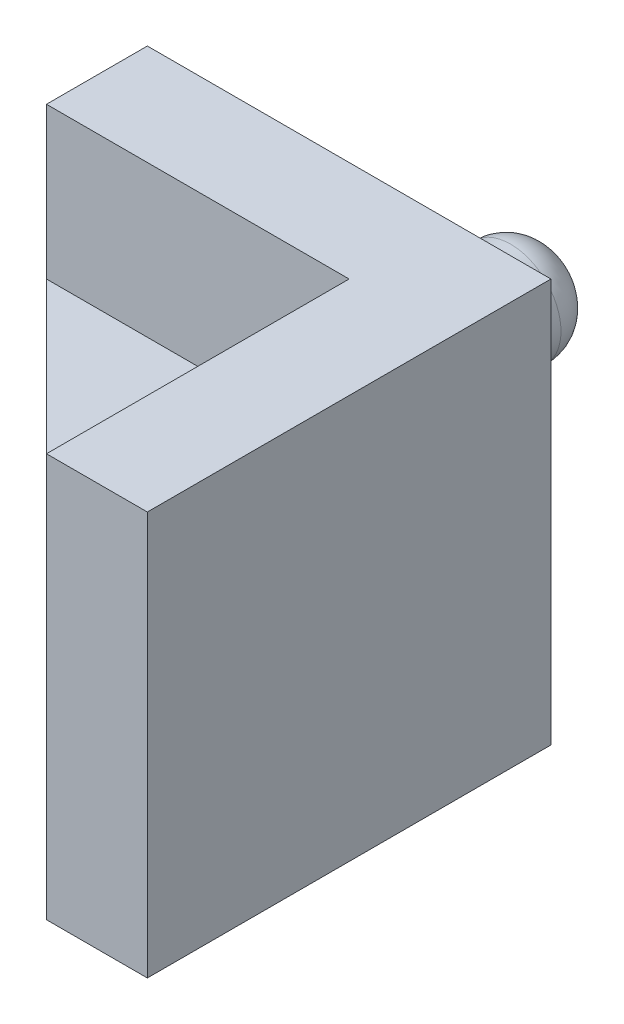
ISO-10303-21;
HEADER;
FILE_DESCRIPTION(('STEP AP214'),'2;1');
FILE_NAME('part.step','',(''),(''),'','','');
FILE_SCHEMA(('AUTOMOTIVE_DESIGN { 1 0 10303 214 1 1 1 1 }'));
ENDSEC;
DATA;
#1=APPLICATION_CONTEXT('core data for automotive mechanical design processes');
#2=APPLICATION_PROTOCOL_DEFINITION('international standard','automotive_design',2000,#1);
#3=PRODUCT_CONTEXT('',#1,'mechanical');
#4=PRODUCT('Part','Part','',(#3));
#5=PRODUCT_RELATED_PRODUCT_CATEGORY('part','',(#4));
#6=PRODUCT_DEFINITION_FORMATION('','',#4);
#7=PRODUCT_DEFINITION_CONTEXT('part definition',#1,'design');
#8=PRODUCT_DEFINITION('design','',#6,#7);
#9=PRODUCT_DEFINITION_SHAPE('','',#8);
#10=(LENGTH_UNIT() NAMED_UNIT(*) SI_UNIT(.MILLI.,.METRE.));
#11=(NAMED_UNIT(*) PLANE_ANGLE_UNIT() SI_UNIT($,.RADIAN.));
#12=(NAMED_UNIT(*) SI_UNIT($,.STERADIAN.) SOLID_ANGLE_UNIT());
#13=UNCERTAINTY_MEASURE_WITH_UNIT(LENGTH_MEASURE(1.E-05),#10,'distance_accuracy_value','');
#14=(GEOMETRIC_REPRESENTATION_CONTEXT(3) GLOBAL_UNCERTAINTY_ASSIGNED_CONTEXT((#13)) GLOBAL_UNIT_ASSIGNED_CONTEXT((#10,
#11,#12)) REPRESENTATION_CONTEXT('',''));
#15=CARTESIAN_POINT('',(0.,0.,0.));
#16=DIRECTION('',(0.,0.,1.));
#17=DIRECTION('',(1.,0.,0.));
#18=AXIS2_PLACEMENT_3D('',#15,#16,#17);
#19=CARTESIAN_POINT('',(0.,10.,-15.));
#20=DIRECTION('',(1.,0.,0.));
#21=DIRECTION('',(0.,0.,-1.));
#22=AXIS2_PLACEMENT_3D('',#19,#20,#21);
#23=PLANE('',#22);
#24=DIRECTION('',(0.,0.,1.));
#25=VECTOR('',#24,1.);
#26=CARTESIAN_POINT('',(0.,-2.5,-15.));
#27=LINE('',#26,#25);
#28=CARTESIAN_POINT('',(0.,-2.5,-15.));
#29=VERTEX_POINT('',#28);
#30=CARTESIAN_POINT('',(0.,-2.5,0.));
#31=VERTEX_POINT('',#30);
#32=EDGE_CURVE('E118',#29,#31,#27,.T.);
#33=ORIENTED_EDGE('',*,*,#32,.F.);
#34=DIRECTION('',(0.,-1.,0.));
#35=VECTOR('',#34,1.);
#36=CARTESIAN_POINT('',(0.,10.,-15.));
#37=LINE('',#36,#35);
#38=CARTESIAN_POINT('',(0.,-10.,-15.));
#39=VERTEX_POINT('',#38);
#40=EDGE_CURVE('E106',#29,#39,#37,.T.);
#41=ORIENTED_EDGE('',*,*,#40,.T.);
#42=DIRECTION('',(0.,0.,1.));
#43=VECTOR('',#42,1.);
#44=CARTESIAN_POINT('',(0.,-10.,-15.));
#45=LINE('',#44,#43);
#46=CARTESIAN_POINT('',(0.,-10.,0.));
#47=VERTEX_POINT('',#46);
#48=EDGE_CURVE('E137',#39,#47,#45,.T.);
#49=ORIENTED_EDGE('',*,*,#48,.T.);
#50=DIRECTION('',(0.,-1.,0.));
#51=VECTOR('',#50,1.);
#52=CARTESIAN_POINT('',(0.,10.,0.));
#53=LINE('',#52,#51);
#54=EDGE_CURVE('E48',#31,#47,#53,.T.);
#55=ORIENTED_EDGE('',*,*,#54,.F.);
#56=EDGE_LOOP('',(#33,#41,#49,#55));
#57=FACE_BOUND('',#56,.T.);
#58=ADVANCED_FACE('F33',(#57),#23,.F.);
#59=CARTESIAN_POINT('',(0.,10.,-15.));
#60=DIRECTION('',(0.,0.,-1.));
#61=DIRECTION('',(-1.,0.,0.));
#62=AXIS2_PLACEMENT_3D('',#59,#60,#61);
#63=PLANE('',#62);
#64=DIRECTION('',(1.,0.,0.));
#65=VECTOR('',#64,1.);
#66=CARTESIAN_POINT('',(0.,-2.5,-15.));
#67=LINE('',#66,#65);
#68=CARTESIAN_POINT('',(-15.,-2.5,-15.));
#69=VERTEX_POINT('',#68);
#70=EDGE_CURVE('E109',#69,#29,#67,.T.);
#71=ORIENTED_EDGE('',*,*,#70,.F.);
#72=DIRECTION('',(0.,-1.,0.));
#73=VECTOR('',#72,1.);
#74=CARTESIAN_POINT('',(-15.,10.,-15.));
#75=LINE('',#74,#73);
#76=CARTESIAN_POINT('',(-15.,-10.,-15.));
#77=VERTEX_POINT('',#76);
#78=EDGE_CURVE('E168',#69,#77,#75,.T.);
#79=ORIENTED_EDGE('',*,*,#78,.T.);
#80=DIRECTION('',(1.,0.,0.));
#81=VECTOR('',#80,1.);
#82=CARTESIAN_POINT('',(0.,-10.,-15.));
#83=LINE('',#82,#81);
#84=EDGE_CURVE('E112',#77,#39,#83,.T.);
#85=ORIENTED_EDGE('',*,*,#84,.T.);
#86=ORIENTED_EDGE('',*,*,#40,.F.);
#87=EDGE_LOOP('',(#71,#79,#85,#86));
#88=FACE_BOUND('',#87,.T.);
#89=ADVANCED_FACE('F107',(#88),#63,.F.);
#90=CARTESIAN_POINT('',(0.,10.,-15.));
#91=VERTEX_POINT('',#90);
#92=CARTESIAN_POINT('',(0.,2.5,-15.));
#93=VERTEX_POINT('',#92);
#94=EDGE_CURVE('E114',#91,#93,#37,.T.);
#95=ORIENTED_EDGE('',*,*,#94,.T.);
#96=DIRECTION('',(0.,0.,1.));
#97=VECTOR('',#96,1.);
#98=CARTESIAN_POINT('',(0.,2.5,-15.));
#99=LINE('',#98,#97);
#100=CARTESIAN_POINT('',(0.,2.5,0.));
#101=VERTEX_POINT('',#100);
#102=EDGE_CURVE('E56',#93,#101,#99,.T.);
#103=ORIENTED_EDGE('',*,*,#102,.T.);
#104=CARTESIAN_POINT('',(0.,10.,0.));
#105=VERTEX_POINT('',#104);
#106=EDGE_CURVE('E141',#105,#101,#53,.T.);
#107=ORIENTED_EDGE('',*,*,#106,.F.);
#108=DIRECTION('',(0.,0.,1.));
#109=VECTOR('',#108,1.);
#110=CARTESIAN_POINT('',(0.,10.,-15.));
#111=LINE('',#110,#109);
#112=EDGE_CURVE('E142',#91,#105,#111,.T.);
#113=ORIENTED_EDGE('',*,*,#112,.F.);
#114=EDGE_LOOP('',(#95,#103,#107,#113));
#115=FACE_BOUND('',#114,.T.);
#116=ADVANCED_FACE('F198',(#115),#23,.F.);
#117=CARTESIAN_POINT('',(0.,10.,0.));
#118=DIRECTION('',(0.,0.,-1.));
#119=DIRECTION('',(-1.,0.,0.));
#120=AXIS2_PLACEMENT_3D('',#117,#118,#119);
#121=PLANE('',#120);
#122=ORIENTED_EDGE('',*,*,#106,.T.);
#123=DIRECTION('',(0.,1.,0.));
#124=VECTOR('',#123,1.);
#125=CARTESIAN_POINT('',(0.,10.,0.));
#126=LINE('',#125,#124);
#127=EDGE_CURVE('E134',#31,#101,#126,.T.);
#128=ORIENTED_EDGE('',*,*,#127,.F.);
#129=ORIENTED_EDGE('',*,*,#54,.T.);
#130=DIRECTION('',(1.,0.,0.));
#131=VECTOR('',#130,1.);
#132=CARTESIAN_POINT('',(0.,-10.,0.));
#133=LINE('',#132,#131);
#134=CARTESIAN_POINT('',(5.,-10.,0.));
#135=VERTEX_POINT('',#134);
#136=EDGE_CURVE('E155',#47,#135,#133,.T.);
#137=ORIENTED_EDGE('',*,*,#136,.T.);
#138=DIRECTION('',(0.,-1.,0.));
#139=VECTOR('',#138,1.);
#140=CARTESIAN_POINT('',(5.,10.,0.));
#141=LINE('',#140,#139);
#142=CARTESIAN_POINT('',(5.,10.,0.));
#143=VERTEX_POINT('',#142);
#144=EDGE_CURVE('E177',#143,#135,#141,.T.);
#145=ORIENTED_EDGE('',*,*,#144,.F.);
#146=DIRECTION('',(1.,0.,0.));
#147=VECTOR('',#146,1.);
#148=CARTESIAN_POINT('',(0.,10.,0.));
#149=LINE('',#148,#147);
#150=EDGE_CURVE('E145',#105,#143,#149,.T.);
#151=ORIENTED_EDGE('',*,*,#150,.F.);
#152=EDGE_LOOP('',(#122,#128,#129,#137,#145,#151));
#153=FACE_BOUND('',#152,.T.);
#154=ADVANCED_FACE('F206',(#153),#121,.F.);
#155=CARTESIAN_POINT('',(5.,10.,-20.));
#156=DIRECTION('',(-1.,0.,0.));
#157=DIRECTION('',(0.,0.,1.));
#158=AXIS2_PLACEMENT_3D('',#155,#156,#157);
#159=PLANE('',#158);
#160=ORIENTED_EDGE('',*,*,#144,.T.);
#161=DIRECTION('',(0.,0.,-1.));
#162=VECTOR('',#161,1.);
#163=CARTESIAN_POINT('',(5.,-10.,-20.));
#164=LINE('',#163,#162);
#165=CARTESIAN_POINT('',(5.,-10.,-20.));
#166=VERTEX_POINT('',#165);
#167=EDGE_CURVE('E158',#135,#166,#164,.T.);
#168=ORIENTED_EDGE('',*,*,#167,.T.);
#169=DIRECTION('',(0.,-1.,0.));
#170=VECTOR('',#169,1.);
#171=CARTESIAN_POINT('',(5.,10.,-20.));
#172=LINE('',#171,#170);
#173=CARTESIAN_POINT('',(5.,10.,-20.));
#174=VERTEX_POINT('',#173);
#175=EDGE_CURVE('E175',#174,#166,#172,.T.);
#176=ORIENTED_EDGE('',*,*,#175,.F.);
#177=DIRECTION('',(0.,0.,-1.));
#178=VECTOR('',#177,1.);
#179=CARTESIAN_POINT('',(5.,10.,-20.));
#180=LINE('',#179,#178);
#181=EDGE_CURVE('E147',#143,#174,#180,.T.);
#182=ORIENTED_EDGE('',*,*,#181,.F.);
#183=EDGE_LOOP('',(#160,#168,#176,#182));
#184=FACE_BOUND('',#183,.T.);
#185=ADVANCED_FACE('F210',(#184),#159,.F.);
#186=CARTESIAN_POINT('',(5.,10.,-20.));
#187=DIRECTION('',(0.,0.,1.));
#188=DIRECTION('',(1.,0.,0.));
#189=AXIS2_PLACEMENT_3D('',#186,#187,#188);
#190=PLANE('',#189);
#191=CARTESIAN_POINT('',(-5.,0.,-20.));
#192=DIRECTION('',(0.,0.,-1.));
#193=DIRECTION('',(-1.,0.,0.));
#194=AXIS2_PLACEMENT_3D('',#191,#192,#193);
#195=CIRCLE('',#194,2.5);
#196=CARTESIAN_POINT('',(-7.5,0.,-20.));
#197=VERTEX_POINT('',#196);
#198=EDGE_CURVE('E138',#197,#197,#195,.T.);
#199=ORIENTED_EDGE('',*,*,#198,.F.);
#200=EDGE_LOOP('',(#199));
#201=FACE_BOUND('',#200,.T.);
#202=ORIENTED_EDGE('',*,*,#175,.T.);
#203=DIRECTION('',(-1.,0.,0.));
#204=VECTOR('',#203,1.);
#205=CARTESIAN_POINT('',(5.,-10.,-20.));
#206=LINE('',#205,#204);
#207=CARTESIAN_POINT('',(-15.,-10.,-20.));
#208=VERTEX_POINT('',#207);
#209=EDGE_CURVE('E161',#166,#208,#206,.T.);
#210=ORIENTED_EDGE('',*,*,#209,.T.);
#211=DIRECTION('',(0.,-1.,0.));
#212=VECTOR('',#211,1.);
#213=CARTESIAN_POINT('',(-15.,10.,-20.));
#214=LINE('',#213,#212);
#215=CARTESIAN_POINT('',(-15.,10.,-20.));
#216=VERTEX_POINT('',#215);
#217=EDGE_CURVE('E172',#216,#208,#214,.T.);
#218=ORIENTED_EDGE('',*,*,#217,.F.);
#219=DIRECTION('',(-1.,0.,0.));
#220=VECTOR('',#219,1.);
#221=CARTESIAN_POINT('',(5.,10.,-20.));
#222=LINE('',#221,#220);
#223=EDGE_CURVE('E149',#174,#216,#222,.T.);
#224=ORIENTED_EDGE('',*,*,#223,.F.);
#225=EDGE_LOOP('',(#202,#210,#218,#224));
#226=FACE_BOUND('',#225,.T.);
#227=ADVANCED_FACE('F239',(#201,#226),#190,.F.);
#228=CARTESIAN_POINT('',(-15.,10.,-15.));
#229=DIRECTION('',(1.,0.,0.));
#230=DIRECTION('',(0.,0.,-1.));
#231=AXIS2_PLACEMENT_3D('',#228,#229,#230);
#232=PLANE('',#231);
#233=ORIENTED_EDGE('',*,*,#217,.T.);
#234=DIRECTION('',(0.,0.,1.));
#235=VECTOR('',#234,1.);
#236=CARTESIAN_POINT('',(-15.,-10.,-15.));
#237=LINE('',#236,#235);
#238=EDGE_CURVE('E164',#208,#77,#237,.T.);
#239=ORIENTED_EDGE('',*,*,#238,.T.);
#240=ORIENTED_EDGE('',*,*,#78,.F.);
#241=CARTESIAN_POINT('',(-15.,2.5,-15.));
#242=VERTEX_POINT('',#241);
#243=EDGE_CURVE('E173',#242,#69,#75,.T.);
#244=ORIENTED_EDGE('',*,*,#243,.F.);
#245=CARTESIAN_POINT('',(-15.,10.,-15.));
#246=VERTEX_POINT('',#245);
#247=EDGE_CURVE('E169',#246,#242,#75,.T.);
#248=ORIENTED_EDGE('',*,*,#247,.F.);
#249=DIRECTION('',(0.,0.,1.));
#250=VECTOR('',#249,1.);
#251=CARTESIAN_POINT('',(-15.,10.,-15.));
#252=LINE('',#251,#250);
#253=EDGE_CURVE('E151',#216,#246,#252,.T.);
#254=ORIENTED_EDGE('',*,*,#253,.F.);
#255=EDGE_LOOP('',(#233,#239,#240,#244,#248,#254));
#256=FACE_BOUND('',#255,.T.);
#257=ADVANCED_FACE('F228',(#256),#232,.F.);
#258=ORIENTED_EDGE('',*,*,#247,.T.);
#259=DIRECTION('',(1.,0.,0.));
#260=VECTOR('',#259,1.);
#261=CARTESIAN_POINT('',(0.,2.5,-15.));
#262=LINE('',#261,#260);
#263=EDGE_CURVE('E122',#242,#93,#262,.T.);
#264=ORIENTED_EDGE('',*,*,#263,.T.);
#265=ORIENTED_EDGE('',*,*,#94,.F.);
#266=DIRECTION('',(1.,0.,0.));
#267=VECTOR('',#266,1.);
#268=CARTESIAN_POINT('',(0.,10.,-15.));
#269=LINE('',#268,#267);
#270=EDGE_CURVE('E115',#246,#91,#269,.T.);
#271=ORIENTED_EDGE('',*,*,#270,.F.);
#272=EDGE_LOOP('',(#258,#264,#265,#271));
#273=FACE_BOUND('',#272,.T.);
#274=ADVANCED_FACE('F203',(#273),#63,.F.);
#275=CARTESIAN_POINT('',(0.,10.,0.));
#276=DIRECTION('',(0.,1.,0.));
#277=DIRECTION('',(0.,0.,1.));
#278=AXIS2_PLACEMENT_3D('',#275,#276,#277);
#279=PLANE('',#278);
#280=ORIENTED_EDGE('',*,*,#112,.T.);
#281=ORIENTED_EDGE('',*,*,#150,.T.);
#282=ORIENTED_EDGE('',*,*,#181,.T.);
#283=ORIENTED_EDGE('',*,*,#223,.T.);
#284=ORIENTED_EDGE('',*,*,#253,.T.);
#285=ORIENTED_EDGE('',*,*,#270,.T.);
#286=EDGE_LOOP('',(#280,#281,#282,#283,#284,#285));
#287=FACE_BOUND('',#286,.T.);
#288=ADVANCED_FACE('F224',(#287),#279,.T.);
#289=CARTESIAN_POINT('',(0.,-10.,0.));
#290=DIRECTION('',(0.,1.,0.));
#291=DIRECTION('',(0.,0.,1.));
#292=AXIS2_PLACEMENT_3D('',#289,#290,#291);
#293=PLANE('',#292);
#294=ORIENTED_EDGE('',*,*,#48,.F.);
#295=ORIENTED_EDGE('',*,*,#84,.F.);
#296=ORIENTED_EDGE('',*,*,#238,.F.);
#297=ORIENTED_EDGE('',*,*,#209,.F.);
#298=ORIENTED_EDGE('',*,*,#167,.F.);
#299=ORIENTED_EDGE('',*,*,#136,.F.);
#300=EDGE_LOOP('',(#294,#295,#296,#297,#298,#299));
#301=FACE_BOUND('',#300,.T.);
#302=ADVANCED_FACE('F233',(#301),#293,.F.);
#303=CARTESIAN_POINT('',(-5.00000000000001,0.,-30.));
#304=DIRECTION('',(0.,0.,1.));
#305=DIRECTION('',(1.,0.,0.));
#306=AXIS2_PLACEMENT_3D('',#303,#304,#305);
#307=CYLINDRICAL_SURFACE('',#306,2.5);
#308=ORIENTED_EDGE('',*,*,#198,.T.);
#309=EDGE_LOOP('',(#308));
#310=FACE_BOUND('',#309,.T.);
#311=CARTESIAN_POINT('',(-5.00000000000001,0.,-28.));
#312=DIRECTION('',(0.,0.,-1.));
#313=DIRECTION('',(-1.,0.,0.));
#314=AXIS2_PLACEMENT_3D('',#311,#312,#313);
#315=CIRCLE('',#314,2.5);
#316=CARTESIAN_POINT('',(-7.50000000000001,0.,-28.));
#317=VERTEX_POINT('',#316);
#318=EDGE_CURVE('E11',#317,#317,#315,.F.);
#319=ORIENTED_EDGE('',*,*,#318,.T.);
#320=EDGE_LOOP('',(#319));
#321=FACE_BOUND('',#320,.T.);
#322=ADVANCED_FACE('F194',(#310,#321),#307,.T.);
#323=CARTESIAN_POINT('',(-5.00000000000001,0.,-30.));
#324=DIRECTION('',(0.,0.,-1.));
#325=DIRECTION('',(-1.,0.,0.));
#326=AXIS2_PLACEMENT_3D('',#323,#324,#325);
#327=PLANE('',#326);
#328=CARTESIAN_POINT('',(-5.00000000000001,0.,-30.));
#329=DIRECTION('',(0.,0.,-1.));
#330=DIRECTION('',(-1.,0.,0.));
#331=AXIS2_PLACEMENT_3D('',#328,#329,#330);
#332=CIRCLE('',#331,0.5);
#333=CARTESIAN_POINT('',(-5.50000000000001,0.,-30.));
#334=VERTEX_POINT('',#333);
#335=EDGE_CURVE('E41',#334,#334,#332,.T.);
#336=ORIENTED_EDGE('',*,*,#335,.T.);
#337=EDGE_LOOP('',(#336));
#338=FACE_BOUND('',#337,.T.);
#339=ADVANCED_FACE('F182',(#338),#327,.T.);
#340=CARTESIAN_POINT('',(-5.00000000000001,0.,-28.));
#341=DIRECTION('',(0.,0.,-1.));
#342=DIRECTION('',(-1.,0.,0.));
#343=AXIS2_PLACEMENT_3D('',#340,#341,#342);
#344=DEGENERATE_TOROIDAL_SURFACE('',#343,0.5,2.,.T.);
#345=ORIENTED_EDGE('',*,*,#318,.F.);
#346=EDGE_LOOP('',(#345));
#347=FACE_BOUND('',#346,.T.);
#348=ORIENTED_EDGE('',*,*,#335,.F.);
#349=EDGE_LOOP('',(#348));
#350=FACE_BOUND('',#349,.T.);
#351=ADVANCED_FACE('F35',(#347,#350),#344,.T.);
#352=CARTESIAN_POINT('',(-15.,0.,-15.));
#353=DIRECTION('',(-0.707106781186547,0.,0.707106781186548));
#354=DIRECTION('',(0.707106781186548,0.,0.707106781186547));
#355=AXIS2_PLACEMENT_3D('',#352,#353,#354);
#356=PLANE('',#355);
#357=DIRECTION('',(0.707106781186548,0.,0.707106781186547));
#358=VECTOR('',#357,1.);
#359=CARTESIAN_POINT('',(-15.,-2.5,-15.));
#360=LINE('',#359,#358);
#361=EDGE_CURVE('E125',#69,#31,#360,.T.);
#362=ORIENTED_EDGE('',*,*,#361,.T.);
#363=ORIENTED_EDGE('',*,*,#127,.T.);
#364=DIRECTION('',(0.707106781186548,0.,0.707106781186547));
#365=VECTOR('',#364,1.);
#366=CARTESIAN_POINT('',(-15.,2.5,-15.));
#367=LINE('',#366,#365);
#368=EDGE_CURVE('E126',#242,#101,#367,.T.);
#369=ORIENTED_EDGE('',*,*,#368,.F.);
#370=ORIENTED_EDGE('',*,*,#243,.T.);
#371=EDGE_LOOP('',(#362,#363,#369,#370));
#372=FACE_BOUND('',#371,.T.);
#373=ADVANCED_FACE('F185',(#372),#356,.T.);
#374=CARTESIAN_POINT('',(-5.,2.5,-15.));
#375=DIRECTION('',(0.,1.,0.));
#376=DIRECTION('',(0.,0.,1.));
#377=AXIS2_PLACEMENT_3D('',#374,#375,#376);
#378=PLANE('',#377);
#379=ORIENTED_EDGE('',*,*,#102,.F.);
#380=ORIENTED_EDGE('',*,*,#263,.F.);
#381=ORIENTED_EDGE('',*,*,#368,.T.);
#382=EDGE_LOOP('',(#379,#380,#381));
#383=FACE_BOUND('',#382,.T.);
#384=ADVANCED_FACE('F191',(#383),#378,.T.);
#385=CARTESIAN_POINT('',(-5.,-2.5,-15.));
#386=DIRECTION('',(0.,1.,0.));
#387=DIRECTION('',(0.,0.,1.));
#388=AXIS2_PLACEMENT_3D('',#385,#386,#387);
#389=PLANE('',#388);
#390=ORIENTED_EDGE('',*,*,#70,.T.);
#391=ORIENTED_EDGE('',*,*,#32,.T.);
#392=ORIENTED_EDGE('',*,*,#361,.F.);
#393=EDGE_LOOP('',(#390,#391,#392));
#394=FACE_BOUND('',#393,.T.);
#395=ADVANCED_FACE('F124',(#394),#389,.F.);
#396=CLOSED_SHELL('',(#58,#89,#116,#154,#185,#227,#257,#274,#288,#302,#322,#339,#351,#373,#384,#395));
#397=MANIFOLD_SOLID_BREP('B2',#396);
#398=ADVANCED_BREP_SHAPE_REPRESENTATION('',(#18,#397),#14);
#399=SHAPE_DEFINITION_REPRESENTATION(#9,#398);
ENDSEC;
END-ISO-10303-21;
